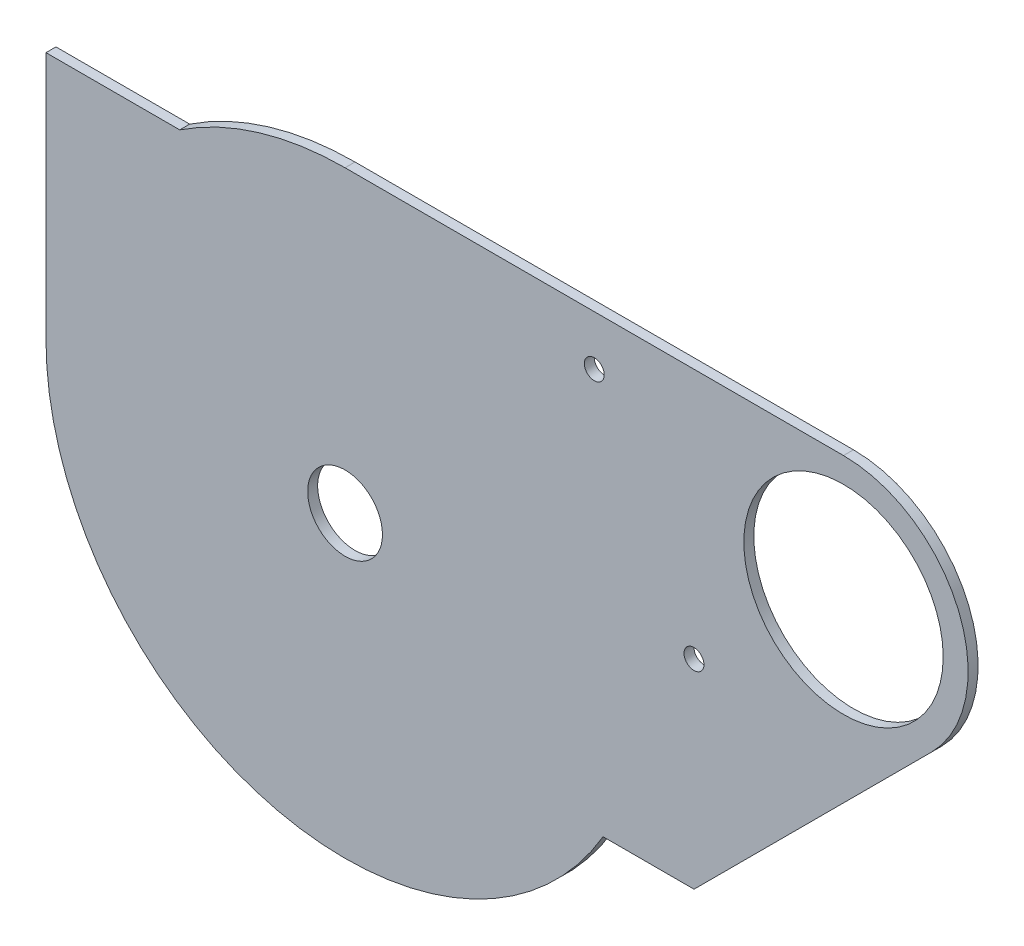
ISO-10303-21;
HEADER;
FILE_DESCRIPTION(('STEP AP214'),'2;1');
FILE_NAME('part.step','',(''),(''),'','','');
FILE_SCHEMA(('AUTOMOTIVE_DESIGN { 1 0 10303 214 1 1 1 1 }'));
ENDSEC;
DATA;
#1=APPLICATION_CONTEXT('core data for automotive mechanical design processes');
#2=APPLICATION_PROTOCOL_DEFINITION('international standard','automotive_design',2000,#1);
#3=PRODUCT_CONTEXT('',#1,'mechanical');
#4=PRODUCT('Part','Part','',(#3));
#5=PRODUCT_RELATED_PRODUCT_CATEGORY('part','',(#4));
#6=PRODUCT_DEFINITION_FORMATION('','',#4);
#7=PRODUCT_DEFINITION_CONTEXT('part definition',#1,'design');
#8=PRODUCT_DEFINITION('design','',#6,#7);
#9=PRODUCT_DEFINITION_SHAPE('','',#8);
#10=(LENGTH_UNIT() NAMED_UNIT(*) SI_UNIT(.MILLI.,.METRE.));
#11=(NAMED_UNIT(*) PLANE_ANGLE_UNIT() SI_UNIT($,.RADIAN.));
#12=(NAMED_UNIT(*) SI_UNIT($,.STERADIAN.) SOLID_ANGLE_UNIT());
#13=UNCERTAINTY_MEASURE_WITH_UNIT(LENGTH_MEASURE(1.E-05),#10,'distance_accuracy_value','');
#14=(GEOMETRIC_REPRESENTATION_CONTEXT(3) GLOBAL_UNCERTAINTY_ASSIGNED_CONTEXT((#13)) GLOBAL_UNIT_ASSIGNED_CONTEXT((#10,
#11,#12)) REPRESENTATION_CONTEXT('',''));
#15=CARTESIAN_POINT('',(0.,0.,0.));
#16=DIRECTION('',(0.,0.,1.));
#17=DIRECTION('',(1.,0.,0.));
#18=AXIS2_PLACEMENT_3D('',#15,#16,#17);
#19=CARTESIAN_POINT('',(-60.,0.,2.));
#20=DIRECTION('',(-1.,0.,0.));
#21=DIRECTION('',(0.,0.,1.));
#22=AXIS2_PLACEMENT_3D('',#19,#20,#21);
#23=PLANE('',#22);
#24=DIRECTION('',(0.,1.,0.));
#25=VECTOR('',#24,1.);
#26=CARTESIAN_POINT('',(-60.,0.,0.));
#27=LINE('',#26,#25);
#28=CARTESIAN_POINT('',(-60.,0.,0.));
#29=VERTEX_POINT('',#28);
#30=CARTESIAN_POINT('',(-60.,50.,0.));
#31=VERTEX_POINT('',#30);
#32=EDGE_CURVE('E157',#29,#31,#27,.T.);
#33=ORIENTED_EDGE('',*,*,#32,.F.);
#34=DIRECTION('',(0.,0.,-1.));
#35=VECTOR('',#34,1.);
#36=CARTESIAN_POINT('',(-60.,0.,2.));
#37=LINE('',#36,#35);
#38=CARTESIAN_POINT('',(-60.,0.,2.));
#39=VERTEX_POINT('',#38);
#40=EDGE_CURVE('E11',#39,#29,#37,.T.);
#41=ORIENTED_EDGE('',*,*,#40,.F.);
#42=DIRECTION('',(0.,1.,0.));
#43=VECTOR('',#42,1.);
#44=CARTESIAN_POINT('',(-60.,0.,2.));
#45=LINE('',#44,#43);
#46=CARTESIAN_POINT('',(-60.,50.,2.));
#47=VERTEX_POINT('',#46);
#48=EDGE_CURVE('E137',#39,#47,#45,.T.);
#49=ORIENTED_EDGE('',*,*,#48,.T.);
#50=DIRECTION('',(0.,0.,-1.));
#51=VECTOR('',#50,1.);
#52=CARTESIAN_POINT('',(-60.,50.,2.));
#53=LINE('',#52,#51);
#54=EDGE_CURVE('E90',#47,#31,#53,.T.);
#55=ORIENTED_EDGE('',*,*,#54,.T.);
#56=EDGE_LOOP('',(#33,#41,#49,#55));
#57=FACE_BOUND('',#56,.T.);
#58=ADVANCED_FACE('F39',(#57),#23,.T.);
#59=CARTESIAN_POINT('',(0.,0.,2.));
#60=DIRECTION('',(0.,0.,-1.));
#61=DIRECTION('',(-1.,0.,0.));
#62=AXIS2_PLACEMENT_3D('',#59,#60,#61);
#63=CYLINDRICAL_SURFACE('',#62,60.);
#64=CARTESIAN_POINT('',(0.,0.,0.));
#65=DIRECTION('',(0.,0.,1.));
#66=DIRECTION('',(1.,0.,0.));
#67=AXIS2_PLACEMENT_3D('',#64,#65,#66);
#68=CIRCLE('',#67,60.);
#69=CARTESIAN_POINT('',(51.7606264996187,-30.3453051453923,0.));
#70=VERTEX_POINT('',#69);
#71=EDGE_CURVE('E211',#29,#70,#68,.T.);
#72=ORIENTED_EDGE('',*,*,#71,.T.);
#73=DIRECTION('',(0.,0.,-1.));
#74=VECTOR('',#73,1.);
#75=CARTESIAN_POINT('',(51.7606264996187,-30.3453051453923,2.));
#76=LINE('',#75,#74);
#77=CARTESIAN_POINT('',(51.7606264996187,-30.3453051453923,2.));
#78=VERTEX_POINT('',#77);
#79=EDGE_CURVE('E47',#78,#70,#76,.T.);
#80=ORIENTED_EDGE('',*,*,#79,.F.);
#81=CARTESIAN_POINT('',(0.,0.,2.));
#82=DIRECTION('',(0.,0.,1.));
#83=DIRECTION('',(1.,0.,0.));
#84=AXIS2_PLACEMENT_3D('',#81,#82,#83);
#85=CIRCLE('',#84,60.);
#86=EDGE_CURVE('E131',#39,#78,#85,.T.);
#87=ORIENTED_EDGE('',*,*,#86,.F.);
#88=ORIENTED_EDGE('',*,*,#40,.T.);
#89=EDGE_LOOP('',(#72,#80,#87,#88));
#90=FACE_BOUND('',#89,.T.);
#91=ADVANCED_FACE('F204',(#90),#63,.T.);
#92=CARTESIAN_POINT('',(0.,-30.3453051453923,2.));
#93=DIRECTION('',(0.,-1.,0.));
#94=DIRECTION('',(0.,0.,-1.));
#95=AXIS2_PLACEMENT_3D('',#92,#93,#94);
#96=PLANE('',#95);
#97=DIRECTION('',(-1.,0.,0.));
#98=VECTOR('',#97,1.);
#99=CARTESIAN_POINT('',(0.,-30.3453051453923,0.));
#100=LINE('',#99,#98);
#101=CARTESIAN_POINT('',(70.0100339139351,-30.3453051453923,0.));
#102=VERTEX_POINT('',#101);
#103=EDGE_CURVE('E214',#102,#70,#100,.T.);
#104=ORIENTED_EDGE('',*,*,#103,.F.);
#105=DIRECTION('',(0.,0.,-1.));
#106=VECTOR('',#105,1.);
#107=CARTESIAN_POINT('',(70.0100339139351,-30.3453051453923,2.));
#108=LINE('',#107,#106);
#109=CARTESIAN_POINT('',(70.0100339139351,-30.3453051453923,2.));
#110=VERTEX_POINT('',#109);
#111=EDGE_CURVE('E236',#110,#102,#108,.T.);
#112=ORIENTED_EDGE('',*,*,#111,.F.);
#113=DIRECTION('',(-1.,0.,0.));
#114=VECTOR('',#113,1.);
#115=CARTESIAN_POINT('',(0.,-30.3453051453923,2.));
#116=LINE('',#115,#114);
#117=EDGE_CURVE('E136',#110,#78,#116,.T.);
#118=ORIENTED_EDGE('',*,*,#117,.T.);
#119=ORIENTED_EDGE('',*,*,#79,.T.);
#120=EDGE_LOOP('',(#104,#112,#118,#119));
#121=FACE_BOUND('',#120,.T.);
#122=ADVANCED_FACE('F208',(#121),#96,.T.);
#123=CARTESIAN_POINT('',(50.1776695296637,-50.1776695296637,2.));
#124=DIRECTION('',(0.707106781186548,-0.707106781186547,0.));
#125=DIRECTION('',(0.707106781186547,0.707106781186548,0.));
#126=AXIS2_PLACEMENT_3D('',#123,#124,#125);
#127=PLANE('',#126);
#128=DIRECTION('',(-0.707106781186547,-0.707106781186548,0.));
#129=VECTOR('',#128,1.);
#130=CARTESIAN_POINT('',(50.1776695296637,-50.1776695296637,0.));
#131=LINE('',#130,#129);
#132=CARTESIAN_POINT('',(117.677669529664,17.3223304703363,0.));
#133=VERTEX_POINT('',#132);
#134=EDGE_CURVE('E222',#133,#102,#131,.T.);
#135=ORIENTED_EDGE('',*,*,#134,.F.);
#136=DIRECTION('',(0.,0.,-1.));
#137=VECTOR('',#136,1.);
#138=CARTESIAN_POINT('',(117.677669529664,17.3223304703363,2.));
#139=LINE('',#138,#137);
#140=CARTESIAN_POINT('',(117.677669529664,17.3223304703363,2.));
#141=VERTEX_POINT('',#140);
#142=EDGE_CURVE('E234',#141,#133,#139,.T.);
#143=ORIENTED_EDGE('',*,*,#142,.F.);
#144=DIRECTION('',(-0.707106781186547,-0.707106781186548,0.));
#145=VECTOR('',#144,1.);
#146=CARTESIAN_POINT('',(50.1776695296637,-50.1776695296637,2.));
#147=LINE('',#146,#145);
#148=EDGE_CURVE('E141',#141,#110,#147,.T.);
#149=ORIENTED_EDGE('',*,*,#148,.T.);
#150=ORIENTED_EDGE('',*,*,#111,.T.);
#151=EDGE_LOOP('',(#135,#143,#149,#150));
#152=FACE_BOUND('',#151,.T.);
#153=ADVANCED_FACE('F242',(#152),#127,.T.);
#154=CARTESIAN_POINT('',(100.,35.,2.));
#155=DIRECTION('',(0.,0.,-1.));
#156=DIRECTION('',(-1.,0.,0.));
#157=AXIS2_PLACEMENT_3D('',#154,#155,#156);
#158=CYLINDRICAL_SURFACE('',#157,25.);
#159=CARTESIAN_POINT('',(100.,35.,0.));
#160=DIRECTION('',(0.,0.,1.));
#161=DIRECTION('',(1.,0.,0.));
#162=AXIS2_PLACEMENT_3D('',#159,#160,#161);
#163=CIRCLE('',#162,25.);
#164=CARTESIAN_POINT('',(100.,60.,0.));
#165=VERTEX_POINT('',#164);
#166=EDGE_CURVE('E225',#133,#165,#163,.T.);
#167=ORIENTED_EDGE('',*,*,#166,.T.);
#168=DIRECTION('',(0.,0.,-1.));
#169=VECTOR('',#168,1.);
#170=CARTESIAN_POINT('',(100.,60.,2.));
#171=LINE('',#170,#169);
#172=CARTESIAN_POINT('',(100.,60.,2.));
#173=VERTEX_POINT('',#172);
#174=EDGE_CURVE('E126',#173,#165,#171,.T.);
#175=ORIENTED_EDGE('',*,*,#174,.F.);
#176=CARTESIAN_POINT('',(100.,35.,2.));
#177=DIRECTION('',(0.,0.,1.));
#178=DIRECTION('',(1.,0.,0.));
#179=AXIS2_PLACEMENT_3D('',#176,#177,#178);
#180=CIRCLE('',#179,25.);
#181=EDGE_CURVE('E117',#141,#173,#180,.T.);
#182=ORIENTED_EDGE('',*,*,#181,.F.);
#183=ORIENTED_EDGE('',*,*,#142,.T.);
#184=EDGE_LOOP('',(#167,#175,#182,#183));
#185=FACE_BOUND('',#184,.T.);
#186=ADVANCED_FACE('F259',(#185),#158,.T.);
#187=CARTESIAN_POINT('',(0.,60.,2.));
#188=DIRECTION('',(0.,-1.,0.));
#189=DIRECTION('',(0.,0.,-1.));
#190=AXIS2_PLACEMENT_3D('',#187,#188,#189);
#191=PLANE('',#190);
#192=DIRECTION('',(-1.,0.,0.));
#193=VECTOR('',#192,1.);
#194=CARTESIAN_POINT('',(0.,60.,0.));
#195=LINE('',#194,#193);
#196=CARTESIAN_POINT('',(0.,60.,0.));
#197=VERTEX_POINT('',#196);
#198=EDGE_CURVE('E125',#165,#197,#195,.T.);
#199=ORIENTED_EDGE('',*,*,#198,.T.);
#200=DIRECTION('',(0.,0.,-1.));
#201=VECTOR('',#200,1.);
#202=CARTESIAN_POINT('',(0.,60.,2.));
#203=LINE('',#202,#201);
#204=CARTESIAN_POINT('',(0.,60.,2.));
#205=VERTEX_POINT('',#204);
#206=EDGE_CURVE('E122',#205,#197,#203,.T.);
#207=ORIENTED_EDGE('',*,*,#206,.F.);
#208=DIRECTION('',(-1.,0.,0.));
#209=VECTOR('',#208,1.);
#210=CARTESIAN_POINT('',(0.,60.,2.));
#211=LINE('',#210,#209);
#212=EDGE_CURVE('E109',#173,#205,#211,.T.);
#213=ORIENTED_EDGE('',*,*,#212,.F.);
#214=ORIENTED_EDGE('',*,*,#174,.T.);
#215=EDGE_LOOP('',(#199,#207,#213,#214));
#216=FACE_BOUND('',#215,.T.);
#217=ADVANCED_FACE('F123',(#216),#191,.F.);
#218=CARTESIAN_POINT('',(-33.166247903554,50.,0.));
#219=VERTEX_POINT('',#218);
#220=EDGE_CURVE('E83',#197,#219,#68,.T.);
#221=ORIENTED_EDGE('',*,*,#220,.T.);
#222=DIRECTION('',(0.,0.,-1.));
#223=VECTOR('',#222,1.);
#224=CARTESIAN_POINT('',(-33.166247903554,50.,2.));
#225=LINE('',#224,#223);
#226=CARTESIAN_POINT('',(-33.166247903554,50.,2.));
#227=VERTEX_POINT('',#226);
#228=EDGE_CURVE('E127',#227,#219,#225,.T.);
#229=ORIENTED_EDGE('',*,*,#228,.F.);
#230=EDGE_CURVE('E114',#205,#227,#85,.T.);
#231=ORIENTED_EDGE('',*,*,#230,.F.);
#232=ORIENTED_EDGE('',*,*,#206,.T.);
#233=EDGE_LOOP('',(#221,#229,#231,#232));
#234=FACE_BOUND('',#233,.T.);
#235=ADVANCED_FACE('F129',(#234),#63,.T.);
#236=CARTESIAN_POINT('',(100.,35.,2.));
#237=DIRECTION('',(0.,0.,-1.));
#238=DIRECTION('',(-1.,0.,0.));
#239=AXIS2_PLACEMENT_3D('',#236,#237,#238);
#240=CYLINDRICAL_SURFACE('',#239,20.);
#241=CARTESIAN_POINT('',(100.,35.,2.));
#242=DIRECTION('',(0.,0.,1.));
#243=DIRECTION('',(1.,0.,0.));
#244=AXIS2_PLACEMENT_3D('',#241,#242,#243);
#245=CIRCLE('',#244,20.);
#246=CARTESIAN_POINT('',(120.,35.,2.));
#247=VERTEX_POINT('',#246);
#248=EDGE_CURVE('E132',#247,#247,#245,.T.);
#249=ORIENTED_EDGE('',*,*,#248,.T.);
#250=EDGE_LOOP('',(#249));
#251=FACE_BOUND('',#250,.T.);
#252=CARTESIAN_POINT('',(100.,35.,0.));
#253=DIRECTION('',(0.,0.,1.));
#254=DIRECTION('',(1.,0.,0.));
#255=AXIS2_PLACEMENT_3D('',#252,#253,#254);
#256=CIRCLE('',#255,20.);
#257=CARTESIAN_POINT('',(120.,35.,0.));
#258=VERTEX_POINT('',#257);
#259=EDGE_CURVE('E144',#258,#258,#256,.T.);
#260=ORIENTED_EDGE('',*,*,#259,.F.);
#261=EDGE_LOOP('',(#260));
#262=FACE_BOUND('',#261,.T.);
#263=ADVANCED_FACE('F198',(#251,#262),#240,.F.);
#264=CARTESIAN_POINT('',(0.,50.,2.));
#265=DIRECTION('',(0.,-1.,0.));
#266=DIRECTION('',(0.,0.,-1.));
#267=AXIS2_PLACEMENT_3D('',#264,#265,#266);
#268=PLANE('',#267);
#269=DIRECTION('',(-1.,0.,0.));
#270=VECTOR('',#269,1.);
#271=CARTESIAN_POINT('',(0.,50.,0.));
#272=LINE('',#271,#270);
#273=EDGE_CURVE('E228',#219,#31,#272,.T.);
#274=ORIENTED_EDGE('',*,*,#273,.T.);
#275=ORIENTED_EDGE('',*,*,#54,.F.);
#276=DIRECTION('',(-1.,0.,0.));
#277=VECTOR('',#276,1.);
#278=CARTESIAN_POINT('',(0.,50.,2.));
#279=LINE('',#278,#277);
#280=EDGE_CURVE('E55',#227,#47,#279,.T.);
#281=ORIENTED_EDGE('',*,*,#280,.F.);
#282=ORIENTED_EDGE('',*,*,#228,.T.);
#283=EDGE_LOOP('',(#274,#275,#281,#282));
#284=FACE_BOUND('',#283,.T.);
#285=ADVANCED_FACE('F191',(#284),#268,.F.);
#286=CARTESIAN_POINT('',(0.,0.,2.));
#287=DIRECTION('',(0.,0.,-1.));
#288=DIRECTION('',(-1.,0.,0.));
#289=AXIS2_PLACEMENT_3D('',#286,#287,#288);
#290=CYLINDRICAL_SURFACE('',#289,7.5);
#291=CARTESIAN_POINT('',(0.,0.,2.));
#292=DIRECTION('',(0.,0.,1.));
#293=DIRECTION('',(1.,0.,0.));
#294=AXIS2_PLACEMENT_3D('',#291,#292,#293);
#295=CIRCLE('',#294,7.5);
#296=CARTESIAN_POINT('',(7.5,0.,2.));
#297=VERTEX_POINT('',#296);
#298=EDGE_CURVE('E217',#297,#297,#295,.T.);
#299=ORIENTED_EDGE('',*,*,#298,.T.);
#300=EDGE_LOOP('',(#299));
#301=FACE_BOUND('',#300,.T.);
#302=CARTESIAN_POINT('',(0.,0.,0.));
#303=DIRECTION('',(0.,0.,1.));
#304=DIRECTION('',(1.,0.,0.));
#305=AXIS2_PLACEMENT_3D('',#302,#303,#304);
#306=CIRCLE('',#305,7.5);
#307=CARTESIAN_POINT('',(7.5,0.,0.));
#308=VERTEX_POINT('',#307);
#309=EDGE_CURVE('E142',#308,#308,#306,.T.);
#310=ORIENTED_EDGE('',*,*,#309,.F.);
#311=EDGE_LOOP('',(#310));
#312=FACE_BOUND('',#311,.T.);
#313=ADVANCED_FACE('F167',(#301,#312),#290,.F.);
#314=CARTESIAN_POINT('',(0.,0.,2.));
#315=DIRECTION('',(0.,0.,1.));
#316=DIRECTION('',(1.,0.,0.));
#317=AXIS2_PLACEMENT_3D('',#314,#315,#316);
#318=PLANE('',#317);
#319=CARTESIAN_POINT('',(50.,50.,2.));
#320=DIRECTION('',(0.,0.,1.));
#321=DIRECTION('',(1.,0.,0.));
#322=AXIS2_PLACEMENT_3D('',#319,#320,#321);
#323=CIRCLE('',#322,2.);
#324=CARTESIAN_POINT('',(52.,50.,2.));
#325=VERTEX_POINT('',#324);
#326=EDGE_CURVE('E150',#325,#325,#323,.T.);
#327=ORIENTED_EDGE('',*,*,#326,.F.);
#328=EDGE_LOOP('',(#327));
#329=FACE_BOUND('',#328,.T.);
#330=CARTESIAN_POINT('',(70.,9.65469485460766,2.));
#331=DIRECTION('',(0.,0.,1.));
#332=DIRECTION('',(1.,0.,0.));
#333=AXIS2_PLACEMENT_3D('',#330,#331,#332);
#334=CIRCLE('',#333,2.);
#335=CARTESIAN_POINT('',(72.,9.65469485460766,2.));
#336=VERTEX_POINT('',#335);
#337=EDGE_CURVE('E151',#336,#336,#334,.T.);
#338=ORIENTED_EDGE('',*,*,#337,.F.);
#339=EDGE_LOOP('',(#338));
#340=FACE_BOUND('',#339,.T.);
#341=ORIENTED_EDGE('',*,*,#48,.F.);
#342=ORIENTED_EDGE('',*,*,#86,.T.);
#343=ORIENTED_EDGE('',*,*,#117,.F.);
#344=ORIENTED_EDGE('',*,*,#148,.F.);
#345=ORIENTED_EDGE('',*,*,#181,.T.);
#346=ORIENTED_EDGE('',*,*,#212,.T.);
#347=ORIENTED_EDGE('',*,*,#230,.T.);
#348=ORIENTED_EDGE('',*,*,#280,.T.);
#349=EDGE_LOOP('',(#341,#342,#343,#344,#345,#346,#347,#348));
#350=FACE_BOUND('',#349,.T.);
#351=ORIENTED_EDGE('',*,*,#248,.F.);
#352=EDGE_LOOP('',(#351));
#353=FACE_BOUND('',#352,.T.);
#354=ORIENTED_EDGE('',*,*,#298,.F.);
#355=EDGE_LOOP('',(#354));
#356=FACE_BOUND('',#355,.T.);
#357=ADVANCED_FACE('F111',(#329,#340,#350,#353,#356),#318,.T.);
#358=CARTESIAN_POINT('',(0.,0.,0.));
#359=DIRECTION('',(0.,0.,1.));
#360=DIRECTION('',(1.,0.,0.));
#361=AXIS2_PLACEMENT_3D('',#358,#359,#360);
#362=PLANE('',#361);
#363=CARTESIAN_POINT('',(50.,50.,0.));
#364=DIRECTION('',(0.,0.,1.));
#365=DIRECTION('',(1.,0.,0.));
#366=AXIS2_PLACEMENT_3D('',#363,#364,#365);
#367=CIRCLE('',#366,2.);
#368=CARTESIAN_POINT('',(52.,50.,0.));
#369=VERTEX_POINT('',#368);
#370=EDGE_CURVE('E154',#369,#369,#367,.F.);
#371=ORIENTED_EDGE('',*,*,#370,.F.);
#372=EDGE_LOOP('',(#371));
#373=FACE_BOUND('',#372,.T.);
#374=CARTESIAN_POINT('',(70.,9.65469485460766,0.));
#375=DIRECTION('',(0.,0.,1.));
#376=DIRECTION('',(1.,0.,0.));
#377=AXIS2_PLACEMENT_3D('',#374,#375,#376);
#378=CIRCLE('',#377,2.);
#379=CARTESIAN_POINT('',(72.,9.65469485460766,0.));
#380=VERTEX_POINT('',#379);
#381=EDGE_CURVE('E147',#380,#380,#378,.F.);
#382=ORIENTED_EDGE('',*,*,#381,.F.);
#383=EDGE_LOOP('',(#382));
#384=FACE_BOUND('',#383,.T.);
#385=ORIENTED_EDGE('',*,*,#32,.T.);
#386=ORIENTED_EDGE('',*,*,#273,.F.);
#387=ORIENTED_EDGE('',*,*,#220,.F.);
#388=ORIENTED_EDGE('',*,*,#198,.F.);
#389=ORIENTED_EDGE('',*,*,#166,.F.);
#390=ORIENTED_EDGE('',*,*,#134,.T.);
#391=ORIENTED_EDGE('',*,*,#103,.T.);
#392=ORIENTED_EDGE('',*,*,#71,.F.);
#393=EDGE_LOOP('',(#385,#386,#387,#388,#389,#390,#391,#392));
#394=FACE_BOUND('',#393,.T.);
#395=ORIENTED_EDGE('',*,*,#259,.T.);
#396=EDGE_LOOP('',(#395));
#397=FACE_BOUND('',#396,.T.);
#398=ORIENTED_EDGE('',*,*,#309,.T.);
#399=EDGE_LOOP('',(#398));
#400=FACE_BOUND('',#399,.T.);
#401=ADVANCED_FACE('F166',(#373,#384,#394,#397,#400),#362,.F.);
#402=CARTESIAN_POINT('',(70.,9.65469485460766,-0.00100000000000013));
#403=DIRECTION('',(0.,0.,1.));
#404=DIRECTION('',(1.,0.,0.));
#405=AXIS2_PLACEMENT_3D('',#402,#403,#404);
#406=CYLINDRICAL_SURFACE('',#405,2.);
#407=ORIENTED_EDGE('',*,*,#337,.T.);
#408=EDGE_LOOP('',(#407));
#409=FACE_BOUND('',#408,.T.);
#410=ORIENTED_EDGE('',*,*,#381,.T.);
#411=EDGE_LOOP('',(#410));
#412=FACE_BOUND('',#411,.T.);
#413=ADVANCED_FACE('F171',(#409,#412),#406,.F.);
#414=CARTESIAN_POINT('',(50.,50.,-0.00100000000000013));
#415=DIRECTION('',(0.,0.,1.));
#416=DIRECTION('',(1.,0.,0.));
#417=AXIS2_PLACEMENT_3D('',#414,#415,#416);
#418=CYLINDRICAL_SURFACE('',#417,2.);
#419=ORIENTED_EDGE('',*,*,#326,.T.);
#420=EDGE_LOOP('',(#419));
#421=FACE_BOUND('',#420,.T.);
#422=ORIENTED_EDGE('',*,*,#370,.T.);
#423=EDGE_LOOP('',(#422));
#424=FACE_BOUND('',#423,.T.);
#425=ADVANCED_FACE('F161',(#421,#424),#418,.F.);
#426=CLOSED_SHELL('',(#58,#91,#122,#153,#186,#217,#235,#263,#285,#313,#357,#401,#413,#425));
#427=MANIFOLD_SOLID_BREP('B2',#426);
#428=ADVANCED_BREP_SHAPE_REPRESENTATION('',(#18,#427),#14);
#429=SHAPE_DEFINITION_REPRESENTATION(#9,#428);
ENDSEC;
END-ISO-10303-21;
